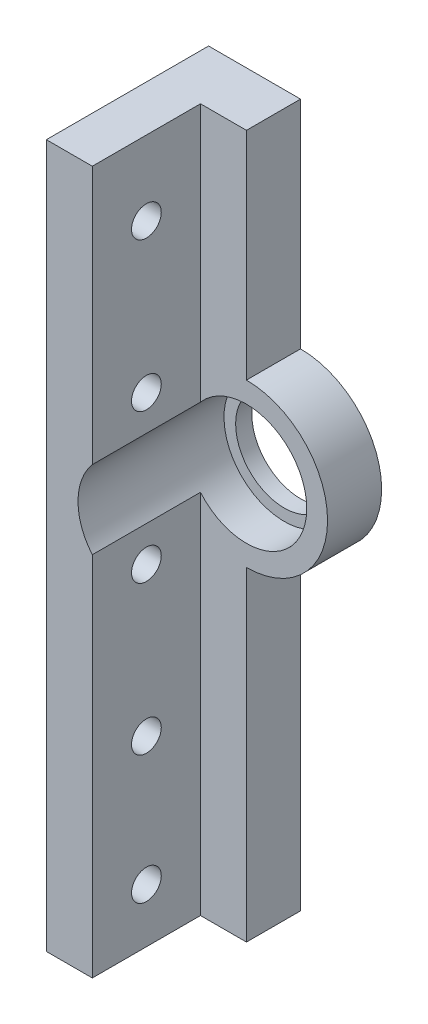
ISO-10303-21;
HEADER;
FILE_DESCRIPTION(('STEP AP214'),'2;1');
FILE_NAME('part.step','',(''),(''),'','','');
FILE_SCHEMA(('AUTOMOTIVE_DESIGN { 1 0 10303 214 1 1 1 1 }'));
ENDSEC;
DATA;
#1=APPLICATION_CONTEXT('core data for automotive mechanical design processes');
#2=APPLICATION_PROTOCOL_DEFINITION('international standard','automotive_design',2000,#1);
#3=PRODUCT_CONTEXT('',#1,'mechanical');
#4=PRODUCT('Part','Part','',(#3));
#5=PRODUCT_RELATED_PRODUCT_CATEGORY('part','',(#4));
#6=PRODUCT_DEFINITION_FORMATION('','',#4);
#7=PRODUCT_DEFINITION_CONTEXT('part definition',#1,'design');
#8=PRODUCT_DEFINITION('design','',#6,#7);
#9=PRODUCT_DEFINITION_SHAPE('','',#8);
#10=(LENGTH_UNIT() NAMED_UNIT(*) SI_UNIT(.MILLI.,.METRE.));
#11=(NAMED_UNIT(*) PLANE_ANGLE_UNIT() SI_UNIT($,.RADIAN.));
#12=(NAMED_UNIT(*) SI_UNIT($,.STERADIAN.) SOLID_ANGLE_UNIT());
#13=UNCERTAINTY_MEASURE_WITH_UNIT(LENGTH_MEASURE(1.E-05),#10,'distance_accuracy_value','');
#14=(GEOMETRIC_REPRESENTATION_CONTEXT(3) GLOBAL_UNCERTAINTY_ASSIGNED_CONTEXT((#13)) GLOBAL_UNIT_ASSIGNED_CONTEXT((#10,
#11,#12)) REPRESENTATION_CONTEXT('',''));
#15=CARTESIAN_POINT('',(0.,0.,0.));
#16=DIRECTION('',(0.,0.,1.));
#17=DIRECTION('',(1.,0.,0.));
#18=AXIS2_PLACEMENT_3D('',#15,#16,#17);
#19=CARTESIAN_POINT('',(0.,0.,0.));
#20=DIRECTION('',(0.,0.,1.));
#21=DIRECTION('',(1.,0.,0.));
#22=AXIS2_PLACEMENT_3D('',#19,#20,#21);
#23=PLANE('',#22);
#24=DIRECTION('',(0.,-1.,0.));
#25=VECTOR('',#24,1.);
#26=CARTESIAN_POINT('',(-8.5,0.,0.));
#27=LINE('',#26,#25);
#28=CARTESIAN_POINT('',(-8.5,-7.21612777048748,0.));
#29=VERTEX_POINT('',#28);
#30=CARTESIAN_POINT('',(-8.5,-75.,0.));
#31=VERTEX_POINT('',#30);
#32=EDGE_CURVE('E110',#29,#31,#27,.T.);
#33=ORIENTED_EDGE('',*,*,#32,.T.);
#34=DIRECTION('',(1.,0.,0.));
#35=VECTOR('',#34,1.);
#36=CARTESIAN_POINT('',(-17.,-75.,0.));
#37=LINE('',#36,#35);
#38=CARTESIAN_POINT('',(0.,-75.,0.));
#39=VERTEX_POINT('',#38);
#40=EDGE_CURVE('E114',#31,#39,#37,.T.);
#41=ORIENTED_EDGE('',*,*,#40,.T.);
#42=DIRECTION('',(0.,1.,0.));
#43=VECTOR('',#42,1.);
#44=CARTESIAN_POINT('',(0.,0.,0.));
#45=LINE('',#44,#43);
#46=CARTESIAN_POINT('',(0.,-15.,0.));
#47=VERTEX_POINT('',#46);
#48=EDGE_CURVE('E195',#39,#47,#45,.T.);
#49=ORIENTED_EDGE('',*,*,#48,.T.);
#50=CARTESIAN_POINT('',(0.,0.,0.));
#51=DIRECTION('',(0.,0.,1.));
#52=DIRECTION('',(1.,0.,0.));
#53=AXIS2_PLACEMENT_3D('',#50,#51,#52);
#54=CIRCLE('',#53,15.);
#55=CARTESIAN_POINT('',(0.,15.,0.));
#56=VERTEX_POINT('',#55);
#57=EDGE_CURVE('E186',#47,#56,#54,.T.);
#58=ORIENTED_EDGE('',*,*,#57,.T.);
#59=DIRECTION('',(0.,1.,0.));
#60=VECTOR('',#59,1.);
#61=CARTESIAN_POINT('',(0.,0.,0.));
#62=LINE('',#61,#60);
#63=CARTESIAN_POINT('',(0.,55.,0.));
#64=VERTEX_POINT('',#63);
#65=EDGE_CURVE('E189',#56,#64,#62,.T.);
#66=ORIENTED_EDGE('',*,*,#65,.T.);
#67=DIRECTION('',(-1.,0.,0.));
#68=VECTOR('',#67,1.);
#69=CARTESIAN_POINT('',(0.,55.,0.));
#70=LINE('',#69,#68);
#71=CARTESIAN_POINT('',(-8.5,55.,0.));
#72=VERTEX_POINT('',#71);
#73=EDGE_CURVE('E192',#64,#72,#70,.T.);
#74=ORIENTED_EDGE('',*,*,#73,.T.);
#75=DIRECTION('',(0.,-1.,0.));
#76=VECTOR('',#75,1.);
#77=CARTESIAN_POINT('',(-8.5,0.,0.));
#78=LINE('',#77,#76);
#79=CARTESIAN_POINT('',(-8.5,7.21612777048744,0.));
#80=VERTEX_POINT('',#79);
#81=EDGE_CURVE('E121',#72,#80,#78,.T.);
#82=ORIENTED_EDGE('',*,*,#81,.T.);
#83=CARTESIAN_POINT('',(0.,0.,0.));
#84=DIRECTION('',(0.,0.,1.));
#85=DIRECTION('',(1.,0.,0.));
#86=AXIS2_PLACEMENT_3D('',#83,#84,#85);
#87=CIRCLE('',#86,11.15);
#88=EDGE_CURVE('E118',#29,#80,#87,.T.);
#89=ORIENTED_EDGE('',*,*,#88,.F.);
#90=EDGE_LOOP('',(#33,#41,#49,#58,#66,#74,#82,#89));
#91=FACE_BOUND('',#90,.T.);
#92=ADVANCED_FACE('F34',(#91),#23,.T.);
#93=CARTESIAN_POINT('',(-17.,-75.,-10.));
#94=DIRECTION('',(1.,0.,0.));
#95=DIRECTION('',(0.,0.,-1.));
#96=AXIS2_PLACEMENT_3D('',#93,#94,#95);
#97=PLANE('',#96);
#98=CARTESIAN_POINT('',(-17.,-65.,9.99999999999998));
#99=DIRECTION('',(1.,0.,0.));
#100=DIRECTION('',(0.,0.,-1.));
#101=AXIS2_PLACEMENT_3D('',#98,#99,#100);
#102=CIRCLE('',#101,2.75);
#103=CARTESIAN_POINT('',(-17.,-65.,7.24999999999998));
#104=VERTEX_POINT('',#103);
#105=EDGE_CURVE('E133',#104,#104,#102,.T.);
#106=ORIENTED_EDGE('',*,*,#105,.T.);
#107=EDGE_LOOP('',(#106));
#108=FACE_BOUND('',#107,.T.);
#109=DIRECTION('',(0.,0.,1.));
#110=VECTOR('',#109,1.);
#111=CARTESIAN_POINT('',(-17.,-75.,-10.));
#112=LINE('',#111,#110);
#113=CARTESIAN_POINT('',(-17.,-75.,-10.));
#114=VERTEX_POINT('',#113);
#115=CARTESIAN_POINT('',(-17.,-75.,20.));
#116=VERTEX_POINT('',#115);
#117=EDGE_CURVE('E222',#114,#116,#112,.T.);
#118=ORIENTED_EDGE('',*,*,#117,.T.);
#119=DIRECTION('',(0.,-1.,0.));
#120=VECTOR('',#119,1.);
#121=CARTESIAN_POINT('',(-17.,55.,20.));
#122=LINE('',#121,#120);
#123=CARTESIAN_POINT('',(-17.,55.,20.));
#124=VERTEX_POINT('',#123);
#125=EDGE_CURVE('E175',#124,#116,#122,.T.);
#126=ORIENTED_EDGE('',*,*,#125,.F.);
#127=DIRECTION('',(0.,0.,1.));
#128=VECTOR('',#127,1.);
#129=CARTESIAN_POINT('',(-17.,55.,-10.));
#130=LINE('',#129,#128);
#131=CARTESIAN_POINT('',(-17.,55.,-10.));
#132=VERTEX_POINT('',#131);
#133=EDGE_CURVE('E220',#132,#124,#130,.T.);
#134=ORIENTED_EDGE('',*,*,#133,.F.);
#135=DIRECTION('',(0.,1.,0.));
#136=VECTOR('',#135,1.);
#137=CARTESIAN_POINT('',(-17.,-75.,-10.));
#138=LINE('',#137,#136);
#139=EDGE_CURVE('E212',#114,#132,#138,.T.);
#140=ORIENTED_EDGE('',*,*,#139,.F.);
#141=EDGE_LOOP('',(#118,#126,#134,#140));
#142=FACE_BOUND('',#141,.T.);
#143=CARTESIAN_POINT('',(-17.,-41.25,9.99999999999993));
#144=DIRECTION('',(1.,0.,0.));
#145=DIRECTION('',(0.,0.,-1.));
#146=AXIS2_PLACEMENT_3D('',#143,#144,#145);
#147=CIRCLE('',#146,2.75);
#148=CARTESIAN_POINT('',(-17.,-41.25,7.24999999999993));
#149=VERTEX_POINT('',#148);
#150=EDGE_CURVE('E157',#149,#149,#147,.F.);
#151=ORIENTED_EDGE('',*,*,#150,.F.);
#152=EDGE_LOOP('',(#151));
#153=FACE_BOUND('',#152,.T.);
#154=CARTESIAN_POINT('',(-17.,41.25,10.));
#155=DIRECTION('',(1.,0.,0.));
#156=DIRECTION('',(0.,0.,-1.));
#157=AXIS2_PLACEMENT_3D('',#154,#155,#156);
#158=CIRCLE('',#157,2.75);
#159=CARTESIAN_POINT('',(-17.,41.25,7.25));
#160=VERTEX_POINT('',#159);
#161=EDGE_CURVE('E163',#160,#160,#158,.T.);
#162=ORIENTED_EDGE('',*,*,#161,.T.);
#163=EDGE_LOOP('',(#162));
#164=FACE_BOUND('',#163,.T.);
#165=CARTESIAN_POINT('',(-17.,13.75,10.));
#166=DIRECTION('',(1.,0.,0.));
#167=DIRECTION('',(0.,0.,-1.));
#168=AXIS2_PLACEMENT_3D('',#165,#166,#167);
#169=CIRCLE('',#168,2.75);
#170=CARTESIAN_POINT('',(-17.,13.75,7.25));
#171=VERTEX_POINT('',#170);
#172=EDGE_CURVE('E160',#171,#171,#169,.F.);
#173=ORIENTED_EDGE('',*,*,#172,.F.);
#174=EDGE_LOOP('',(#173));
#175=FACE_BOUND('',#174,.T.);
#176=CARTESIAN_POINT('',(-17.,-13.75,9.99999999999998));
#177=DIRECTION('',(1.,0.,0.));
#178=DIRECTION('',(0.,0.,-1.));
#179=AXIS2_PLACEMENT_3D('',#176,#177,#178);
#180=CIRCLE('',#179,2.75);
#181=CARTESIAN_POINT('',(-17.,-13.75,7.24999999999998));
#182=VERTEX_POINT('',#181);
#183=EDGE_CURVE('E154',#182,#182,#180,.T.);
#184=ORIENTED_EDGE('',*,*,#183,.T.);
#185=EDGE_LOOP('',(#184));
#186=FACE_BOUND('',#185,.T.);
#187=ADVANCED_FACE('F227',(#108,#142,#153,#164,#175,#186),#97,.F.);
#188=CARTESIAN_POINT('',(-8.5,0.,10.));
#189=DIRECTION('',(1.,0.,0.));
#190=DIRECTION('',(0.,0.,-1.));
#191=AXIS2_PLACEMENT_3D('',#188,#189,#190);
#192=PLANE('',#191);
#193=CARTESIAN_POINT('',(-8.5,13.75,10.));
#194=DIRECTION('',(1.,0.,0.));
#195=DIRECTION('',(0.,0.,-1.));
#196=AXIS2_PLACEMENT_3D('',#193,#194,#195);
#197=CIRCLE('',#196,2.75);
#198=CARTESIAN_POINT('',(-8.5,13.75,7.25));
#199=VERTEX_POINT('',#198);
#200=EDGE_CURVE('E149',#199,#199,#197,.F.);
#201=ORIENTED_EDGE('',*,*,#200,.T.);
#202=EDGE_LOOP('',(#201));
#203=FACE_BOUND('',#202,.T.);
#204=ORIENTED_EDGE('',*,*,#81,.F.);
#205=DIRECTION('',(0.,0.,-1.));
#206=VECTOR('',#205,1.);
#207=CARTESIAN_POINT('',(-8.5,55.,10.));
#208=LINE('',#207,#206);
#209=CARTESIAN_POINT('',(-8.5,55.,20.));
#210=VERTEX_POINT('',#209);
#211=EDGE_CURVE('E183',#210,#72,#208,.T.);
#212=ORIENTED_EDGE('',*,*,#211,.F.);
#213=DIRECTION('',(0.,1.,0.));
#214=VECTOR('',#213,1.);
#215=CARTESIAN_POINT('',(-8.5,7.21612777048744,20.));
#216=LINE('',#215,#214);
#217=CARTESIAN_POINT('',(-8.5,7.21612777048744,20.));
#218=VERTEX_POINT('',#217);
#219=EDGE_CURVE('E169',#218,#210,#216,.T.);
#220=ORIENTED_EDGE('',*,*,#219,.F.);
#221=DIRECTION('',(0.,0.,-1.));
#222=VECTOR('',#221,1.);
#223=CARTESIAN_POINT('',(-8.5,7.21612777048744,10.));
#224=LINE('',#223,#222);
#225=EDGE_CURVE('E120',#218,#80,#224,.T.);
#226=ORIENTED_EDGE('',*,*,#225,.T.);
#227=EDGE_LOOP('',(#204,#212,#220,#226));
#228=FACE_BOUND('',#227,.T.);
#229=CARTESIAN_POINT('',(-8.5,41.25,10.));
#230=DIRECTION('',(1.,0.,0.));
#231=DIRECTION('',(0.,0.,-1.));
#232=AXIS2_PLACEMENT_3D('',#229,#230,#231);
#233=CIRCLE('',#232,2.75);
#234=CARTESIAN_POINT('',(-8.5,41.25,7.25));
#235=VERTEX_POINT('',#234);
#236=EDGE_CURVE('E146',#235,#235,#233,.T.);
#237=ORIENTED_EDGE('',*,*,#236,.F.);
#238=EDGE_LOOP('',(#237));
#239=FACE_BOUND('',#238,.T.);
#240=ADVANCED_FACE('F254',(#203,#228,#239),#192,.T.);
#241=CARTESIAN_POINT('',(-8.5,0.,10.));
#242=DIRECTION('',(1.,0.,0.));
#243=DIRECTION('',(0.,1.,0.));
#244=AXIS2_PLACEMENT_3D('',#241,#242,#243);
#245=PLANE('',#244);
#246=CARTESIAN_POINT('',(-8.50000000000001,-65.,9.99999999999998));
#247=DIRECTION('',(1.,0.,0.));
#248=DIRECTION('',(0.,1.,0.));
#249=AXIS2_PLACEMENT_3D('',#246,#247,#248);
#250=CIRCLE('',#249,2.75);
#251=CARTESIAN_POINT('',(-8.50000000000001,-62.25,9.99999999999998));
#252=VERTEX_POINT('',#251);
#253=EDGE_CURVE('E566',#252,#252,#250,.T.);
#254=ORIENTED_EDGE('',*,*,#253,.F.);
#255=EDGE_LOOP('',(#254));
#256=FACE_BOUND('',#255,.T.);
#257=ORIENTED_EDGE('',*,*,#32,.F.);
#258=DIRECTION('',(0.,0.,-1.));
#259=VECTOR('',#258,1.);
#260=CARTESIAN_POINT('',(-8.5,-7.21612777048748,10.));
#261=LINE('',#260,#259);
#262=CARTESIAN_POINT('',(-8.5,-7.21612777048748,20.));
#263=VERTEX_POINT('',#262);
#264=EDGE_CURVE('E181',#263,#29,#261,.T.);
#265=ORIENTED_EDGE('',*,*,#264,.F.);
#266=DIRECTION('',(0.,1.,0.));
#267=VECTOR('',#266,1.);
#268=CARTESIAN_POINT('',(-8.5,-55.,20.));
#269=LINE('',#268,#267);
#270=CARTESIAN_POINT('',(-8.5,-75.,20.));
#271=VERTEX_POINT('',#270);
#272=EDGE_CURVE('E128',#271,#263,#269,.T.);
#273=ORIENTED_EDGE('',*,*,#272,.F.);
#274=DIRECTION('',(0.,0.,-1.));
#275=VECTOR('',#274,1.);
#276=CARTESIAN_POINT('',(-8.5,-75.,0.));
#277=LINE('',#276,#275);
#278=EDGE_CURVE('E124',#271,#31,#277,.T.);
#279=ORIENTED_EDGE('',*,*,#278,.T.);
#280=EDGE_LOOP('',(#257,#265,#273,#279));
#281=FACE_BOUND('',#280,.T.);
#282=CARTESIAN_POINT('',(-8.5,-13.75,9.99999999999998));
#283=DIRECTION('',(1.,0.,0.));
#284=DIRECTION('',(0.,0.,-1.));
#285=AXIS2_PLACEMENT_3D('',#282,#283,#284);
#286=CIRCLE('',#285,2.75);
#287=CARTESIAN_POINT('',(-8.5,-13.75,7.24999999999998));
#288=VERTEX_POINT('',#287);
#289=EDGE_CURVE('E142',#288,#288,#286,.T.);
#290=ORIENTED_EDGE('',*,*,#289,.F.);
#291=EDGE_LOOP('',(#290));
#292=FACE_BOUND('',#291,.T.);
#293=CARTESIAN_POINT('',(-8.5,-41.25,9.99999999999993));
#294=DIRECTION('',(1.,0.,0.));
#295=DIRECTION('',(0.,0.,-1.));
#296=AXIS2_PLACEMENT_3D('',#293,#294,#295);
#297=CIRCLE('',#296,2.75);
#298=CARTESIAN_POINT('',(-8.5,-41.25,7.24999999999993));
#299=VERTEX_POINT('',#298);
#300=EDGE_CURVE('E139',#299,#299,#297,.F.);
#301=ORIENTED_EDGE('',*,*,#300,.T.);
#302=EDGE_LOOP('',(#301));
#303=FACE_BOUND('',#302,.T.);
#304=ADVANCED_FACE('F125',(#256,#281,#292,#303),#245,.T.);
#305=CARTESIAN_POINT('',(0.,0.,-7.));
#306=DIRECTION('',(0.,0.,-1.));
#307=DIRECTION('',(-1.,0.,0.));
#308=AXIS2_PLACEMENT_3D('',#305,#306,#307);
#309=PLANE('',#308);
#310=CARTESIAN_POINT('',(0.,0.,-7.));
#311=DIRECTION('',(0.,0.,-1.));
#312=DIRECTION('',(-1.,0.,0.));
#313=AXIS2_PLACEMENT_3D('',#310,#311,#312);
#314=CIRCLE('',#313,9.);
#315=CARTESIAN_POINT('',(-9.,0.,-7.));
#316=VERTEX_POINT('',#315);
#317=EDGE_CURVE('E198',#316,#316,#314,.T.);
#318=ORIENTED_EDGE('',*,*,#317,.T.);
#319=EDGE_LOOP('',(#318));
#320=FACE_BOUND('',#319,.T.);
#321=CARTESIAN_POINT('',(0.,0.,-7.));
#322=DIRECTION('',(0.,0.,1.));
#323=DIRECTION('',(1.,0.,0.));
#324=AXIS2_PLACEMENT_3D('',#321,#322,#323);
#325=CIRCLE('',#324,11.15);
#326=CARTESIAN_POINT('',(11.15,0.,-7.));
#327=VERTEX_POINT('',#326);
#328=EDGE_CURVE('E185',#327,#327,#325,.T.);
#329=ORIENTED_EDGE('',*,*,#328,.T.);
#330=EDGE_LOOP('',(#329));
#331=FACE_BOUND('',#330,.T.);
#332=ADVANCED_FACE('F303',(#320,#331),#309,.F.);
#333=CARTESIAN_POINT('',(0.,0.,-10.));
#334=DIRECTION('',(0.,0.,-1.));
#335=DIRECTION('',(-1.,0.,0.));
#336=AXIS2_PLACEMENT_3D('',#333,#334,#335);
#337=PLANE('',#336);
#338=CARTESIAN_POINT('',(0.,0.,-10.));
#339=DIRECTION('',(0.,0.,-1.));
#340=DIRECTION('',(-1.,0.,0.));
#341=AXIS2_PLACEMENT_3D('',#338,#339,#340);
#342=CIRCLE('',#341,15.);
#343=CARTESIAN_POINT('',(0.,15.,-10.));
#344=VERTEX_POINT('',#343);
#345=CARTESIAN_POINT('',(0.,-15.,-10.));
#346=VERTEX_POINT('',#345);
#347=EDGE_CURVE('E204',#344,#346,#342,.T.);
#348=ORIENTED_EDGE('',*,*,#347,.T.);
#349=DIRECTION('',(0.,-1.,0.));
#350=VECTOR('',#349,1.);
#351=CARTESIAN_POINT('',(0.,-15.,-10.));
#352=LINE('',#351,#350);
#353=CARTESIAN_POINT('',(0.,-75.,-10.));
#354=VERTEX_POINT('',#353);
#355=EDGE_CURVE('E208',#346,#354,#352,.T.);
#356=ORIENTED_EDGE('',*,*,#355,.T.);
#357=DIRECTION('',(-1.,0.,0.));
#358=VECTOR('',#357,1.);
#359=CARTESIAN_POINT('',(0.,-75.,-10.));
#360=LINE('',#359,#358);
#361=EDGE_CURVE('E210',#354,#114,#360,.T.);
#362=ORIENTED_EDGE('',*,*,#361,.T.);
#363=ORIENTED_EDGE('',*,*,#139,.T.);
#364=DIRECTION('',(1.,0.,0.));
#365=VECTOR('',#364,1.);
#366=CARTESIAN_POINT('',(-17.,55.,-10.));
#367=LINE('',#366,#365);
#368=CARTESIAN_POINT('',(0.,55.,-10.));
#369=VERTEX_POINT('',#368);
#370=EDGE_CURVE('E54',#132,#369,#367,.T.);
#371=ORIENTED_EDGE('',*,*,#370,.T.);
#372=DIRECTION('',(0.,-1.,0.));
#373=VECTOR('',#372,1.);
#374=CARTESIAN_POINT('',(0.,55.,-10.));
#375=LINE('',#374,#373);
#376=EDGE_CURVE('E49',#369,#344,#375,.T.);
#377=ORIENTED_EDGE('',*,*,#376,.T.);
#378=EDGE_LOOP('',(#348,#356,#362,#363,#371,#377));
#379=FACE_BOUND('',#378,.T.);
#380=CARTESIAN_POINT('',(0.,0.,-10.));
#381=DIRECTION('',(0.,0.,-1.));
#382=DIRECTION('',(-1.,0.,0.));
#383=AXIS2_PLACEMENT_3D('',#380,#381,#382);
#384=CIRCLE('',#383,9.);
#385=CARTESIAN_POINT('',(-9.,0.,-10.));
#386=VERTEX_POINT('',#385);
#387=EDGE_CURVE('E201',#386,#386,#384,.T.);
#388=ORIENTED_EDGE('',*,*,#387,.F.);
#389=EDGE_LOOP('',(#388));
#390=FACE_BOUND('',#389,.T.);
#391=ADVANCED_FACE('F245',(#379,#390),#337,.T.);
#392=CARTESIAN_POINT('',(0.,0.,-10.));
#393=DIRECTION('',(0.,0.,1.));
#394=DIRECTION('',(1.,0.,0.));
#395=AXIS2_PLACEMENT_3D('',#392,#393,#394);
#396=CYLINDRICAL_SURFACE('',#395,15.);
#397=DIRECTION('',(0.,0.,1.));
#398=VECTOR('',#397,1.);
#399=CARTESIAN_POINT('',(0.,15.,-10.));
#400=LINE('',#399,#398);
#401=EDGE_CURVE('E216',#344,#56,#400,.T.);
#402=ORIENTED_EDGE('',*,*,#401,.T.);
#403=ORIENTED_EDGE('',*,*,#57,.F.);
#404=DIRECTION('',(0.,0.,1.));
#405=VECTOR('',#404,1.);
#406=CARTESIAN_POINT('',(0.,-15.,-10.));
#407=LINE('',#406,#405);
#408=EDGE_CURVE('E11',#346,#47,#407,.T.);
#409=ORIENTED_EDGE('',*,*,#408,.F.);
#410=ORIENTED_EDGE('',*,*,#347,.F.);
#411=EDGE_LOOP('',(#402,#403,#409,#410));
#412=FACE_BOUND('',#411,.T.);
#413=ADVANCED_FACE('F36',(#412),#396,.T.);
#414=CARTESIAN_POINT('',(0.,-15.,-10.));
#415=DIRECTION('',(-1.,0.,0.));
#416=DIRECTION('',(0.,-1.,0.));
#417=AXIS2_PLACEMENT_3D('',#414,#415,#416);
#418=PLANE('',#417);
#419=ORIENTED_EDGE('',*,*,#48,.F.);
#420=DIRECTION('',(0.,0.,1.));
#421=VECTOR('',#420,1.);
#422=CARTESIAN_POINT('',(0.,-75.,-10.));
#423=LINE('',#422,#421);
#424=EDGE_CURVE('E42',#354,#39,#423,.T.);
#425=ORIENTED_EDGE('',*,*,#424,.F.);
#426=ORIENTED_EDGE('',*,*,#355,.F.);
#427=ORIENTED_EDGE('',*,*,#408,.T.);
#428=EDGE_LOOP('',(#419,#425,#426,#427));
#429=FACE_BOUND('',#428,.T.);
#430=ADVANCED_FACE('F248',(#429),#418,.F.);
#431=CARTESIAN_POINT('',(0.,-75.,-10.));
#432=DIRECTION('',(0.,1.,0.));
#433=DIRECTION('',(0.,0.,1.));
#434=AXIS2_PLACEMENT_3D('',#431,#432,#433);
#435=PLANE('',#434);
#436=ORIENTED_EDGE('',*,*,#424,.T.);
#437=ORIENTED_EDGE('',*,*,#40,.F.);
#438=ORIENTED_EDGE('',*,*,#278,.F.);
#439=DIRECTION('',(1.,0.,0.));
#440=VECTOR('',#439,1.);
#441=CARTESIAN_POINT('',(-8.5,-75.,20.));
#442=LINE('',#441,#440);
#443=EDGE_CURVE('E132',#116,#271,#442,.T.);
#444=ORIENTED_EDGE('',*,*,#443,.F.);
#445=ORIENTED_EDGE('',*,*,#117,.F.);
#446=ORIENTED_EDGE('',*,*,#361,.F.);
#447=EDGE_LOOP('',(#436,#437,#438,#444,#445,#446));
#448=FACE_BOUND('',#447,.T.);
#449=ADVANCED_FACE('F135',(#448),#435,.F.);
#450=CARTESIAN_POINT('',(-17.,55.,-10.));
#451=DIRECTION('',(0.,-1.,0.));
#452=DIRECTION('',(0.,0.,-1.));
#453=AXIS2_PLACEMENT_3D('',#450,#451,#452);
#454=PLANE('',#453);
#455=ORIENTED_EDGE('',*,*,#133,.T.);
#456=DIRECTION('',(-1.,0.,0.));
#457=VECTOR('',#456,1.);
#458=CARTESIAN_POINT('',(-8.5,55.,20.));
#459=LINE('',#458,#457);
#460=EDGE_CURVE('E172',#210,#124,#459,.T.);
#461=ORIENTED_EDGE('',*,*,#460,.F.);
#462=ORIENTED_EDGE('',*,*,#211,.T.);
#463=ORIENTED_EDGE('',*,*,#73,.F.);
#464=DIRECTION('',(0.,0.,1.));
#465=VECTOR('',#464,1.);
#466=CARTESIAN_POINT('',(0.,55.,-10.));
#467=LINE('',#466,#465);
#468=EDGE_CURVE('E218',#369,#64,#467,.T.);
#469=ORIENTED_EDGE('',*,*,#468,.F.);
#470=ORIENTED_EDGE('',*,*,#370,.F.);
#471=EDGE_LOOP('',(#455,#461,#462,#463,#469,#470));
#472=FACE_BOUND('',#471,.T.);
#473=ADVANCED_FACE('F235',(#472),#454,.F.);
#474=CARTESIAN_POINT('',(0.,55.,-10.));
#475=DIRECTION('',(-1.,0.,0.));
#476=DIRECTION('',(0.,-1.,0.));
#477=AXIS2_PLACEMENT_3D('',#474,#475,#476);
#478=PLANE('',#477);
#479=ORIENTED_EDGE('',*,*,#468,.T.);
#480=ORIENTED_EDGE('',*,*,#65,.F.);
#481=ORIENTED_EDGE('',*,*,#401,.F.);
#482=ORIENTED_EDGE('',*,*,#376,.F.);
#483=EDGE_LOOP('',(#479,#480,#481,#482));
#484=FACE_BOUND('',#483,.T.);
#485=ADVANCED_FACE('F240',(#484),#478,.F.);
#486=CARTESIAN_POINT('',(0.,0.,-10.));
#487=DIRECTION('',(0.,0.,1.));
#488=DIRECTION('',(1.,0.,0.));
#489=AXIS2_PLACEMENT_3D('',#486,#487,#488);
#490=CYLINDRICAL_SURFACE('',#489,9.);
#491=ORIENTED_EDGE('',*,*,#387,.T.);
#492=EDGE_LOOP('',(#491));
#493=FACE_BOUND('',#492,.T.);
#494=ORIENTED_EDGE('',*,*,#317,.F.);
#495=EDGE_LOOP('',(#494));
#496=FACE_BOUND('',#495,.T.);
#497=ADVANCED_FACE('F297',(#493,#496),#490,.F.);
#498=CARTESIAN_POINT('',(0.,0.,0.));
#499=DIRECTION('',(0.,0.,-1.));
#500=DIRECTION('',(-1.,0.,0.));
#501=AXIS2_PLACEMENT_3D('',#498,#499,#500);
#502=CYLINDRICAL_SURFACE('',#501,11.15);
#503=ORIENTED_EDGE('',*,*,#88,.T.);
#504=ORIENTED_EDGE('',*,*,#225,.F.);
#505=CARTESIAN_POINT('',(0.,0.,20.));
#506=DIRECTION('',(0.,0.,-1.));
#507=DIRECTION('',(1.,0.,0.));
#508=AXIS2_PLACEMENT_3D('',#505,#506,#507);
#509=CIRCLE('',#508,11.15);
#510=EDGE_CURVE('E166',#263,#218,#509,.T.);
#511=ORIENTED_EDGE('',*,*,#510,.F.);
#512=ORIENTED_EDGE('',*,*,#264,.T.);
#513=EDGE_LOOP('',(#503,#504,#511,#512));
#514=FACE_BOUND('',#513,.T.);
#515=ORIENTED_EDGE('',*,*,#328,.F.);
#516=EDGE_LOOP('',(#515));
#517=FACE_BOUND('',#516,.T.);
#518=ADVANCED_FACE('F251',(#514,#517),#502,.F.);
#519=CARTESIAN_POINT('',(0.,0.,20.));
#520=DIRECTION('',(0.,0.,1.));
#521=DIRECTION('',(1.,0.,0.));
#522=AXIS2_PLACEMENT_3D('',#519,#520,#521);
#523=PLANE('',#522);
#524=ORIENTED_EDGE('',*,*,#510,.T.);
#525=ORIENTED_EDGE('',*,*,#219,.T.);
#526=ORIENTED_EDGE('',*,*,#460,.T.);
#527=ORIENTED_EDGE('',*,*,#125,.T.);
#528=ORIENTED_EDGE('',*,*,#443,.T.);
#529=ORIENTED_EDGE('',*,*,#272,.T.);
#530=EDGE_LOOP('',(#524,#525,#526,#527,#528,#529));
#531=FACE_BOUND('',#530,.T.);
#532=ADVANCED_FACE('F231',(#531),#523,.T.);
#533=CARTESIAN_POINT('',(-18.5,-13.75,9.99999999999998));
#534=DIRECTION('',(1.,0.,0.));
#535=DIRECTION('',(0.,0.,-1.));
#536=AXIS2_PLACEMENT_3D('',#533,#534,#535);
#537=CYLINDRICAL_SURFACE('',#536,2.75);
#538=ORIENTED_EDGE('',*,*,#289,.T.);
#539=EDGE_LOOP('',(#538));
#540=FACE_BOUND('',#539,.T.);
#541=ORIENTED_EDGE('',*,*,#183,.F.);
#542=EDGE_LOOP('',(#541));
#543=FACE_BOUND('',#542,.T.);
#544=ADVANCED_FACE('F277',(#540,#543),#537,.F.);
#545=CARTESIAN_POINT('',(-18.5,-41.25,9.99999999999993));
#546=DIRECTION('',(1.,0.,0.));
#547=DIRECTION('',(0.,0.,-1.));
#548=AXIS2_PLACEMENT_3D('',#545,#546,#547);
#549=CYLINDRICAL_SURFACE('',#548,2.75);
#550=ORIENTED_EDGE('',*,*,#300,.F.);
#551=EDGE_LOOP('',(#550));
#552=FACE_BOUND('',#551,.T.);
#553=ORIENTED_EDGE('',*,*,#150,.T.);
#554=EDGE_LOOP('',(#553));
#555=FACE_BOUND('',#554,.T.);
#556=ADVANCED_FACE('F279',(#552,#555),#549,.F.);
#557=CARTESIAN_POINT('',(-18.5,13.75,10.));
#558=DIRECTION('',(1.,0.,0.));
#559=DIRECTION('',(0.,0.,-1.));
#560=AXIS2_PLACEMENT_3D('',#557,#558,#559);
#561=CYLINDRICAL_SURFACE('',#560,2.75);
#562=ORIENTED_EDGE('',*,*,#200,.F.);
#563=EDGE_LOOP('',(#562));
#564=FACE_BOUND('',#563,.T.);
#565=ORIENTED_EDGE('',*,*,#172,.T.);
#566=EDGE_LOOP('',(#565));
#567=FACE_BOUND('',#566,.T.);
#568=ADVANCED_FACE('F265',(#564,#567),#561,.F.);
#569=CARTESIAN_POINT('',(-18.5,41.25,10.));
#570=DIRECTION('',(1.,0.,0.));
#571=DIRECTION('',(0.,0.,-1.));
#572=AXIS2_PLACEMENT_3D('',#569,#570,#571);
#573=CYLINDRICAL_SURFACE('',#572,2.75);
#574=ORIENTED_EDGE('',*,*,#236,.T.);
#575=EDGE_LOOP('',(#574));
#576=FACE_BOUND('',#575,.T.);
#577=ORIENTED_EDGE('',*,*,#161,.F.);
#578=EDGE_LOOP('',(#577));
#579=FACE_BOUND('',#578,.T.);
#580=ADVANCED_FACE('F261',(#576,#579),#573,.F.);
#581=CARTESIAN_POINT('',(-28.5,-65.,9.99999999999998));
#582=DIRECTION('',(1.,0.,0.));
#583=DIRECTION('',(0.,1.,0.));
#584=AXIS2_PLACEMENT_3D('',#581,#582,#583);
#585=CYLINDRICAL_SURFACE('',#584,2.75);
#586=ORIENTED_EDGE('',*,*,#253,.T.);
#587=EDGE_LOOP('',(#586));
#588=FACE_BOUND('',#587,.T.);
#589=ORIENTED_EDGE('',*,*,#105,.F.);
#590=EDGE_LOOP('',(#589));
#591=FACE_BOUND('',#590,.T.);
#592=ADVANCED_FACE('F264',(#588,#591),#585,.F.);
#593=CLOSED_SHELL('',(#92,#187,#240,#304,#332,#391,#413,#430,#449,#473,#485,#497,#518,#532,#544,
#556,#568,#580,#592));
#594=MANIFOLD_SOLID_BREP('B2',#593);
#595=ADVANCED_BREP_SHAPE_REPRESENTATION('',(#18,#594),#14);
#596=SHAPE_DEFINITION_REPRESENTATION(#9,#595);
ENDSEC;
END-ISO-10303-21;
